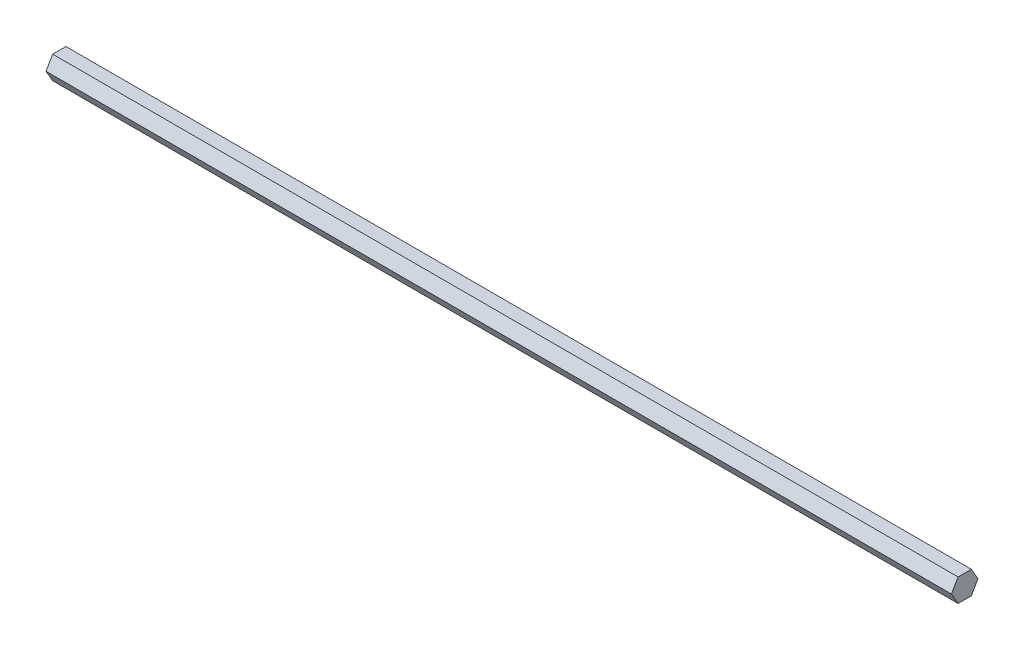
ISO-10303-21;
HEADER;
FILE_DESCRIPTION(('STEP AP214'),'2;1');
FILE_NAME('part.step','',(''),(''),'','','');
FILE_SCHEMA(('AUTOMOTIVE_DESIGN { 1 0 10303 214 1 1 1 1 }'));
ENDSEC;
DATA;
#1=APPLICATION_CONTEXT('core data for automotive mechanical design processes');
#2=APPLICATION_PROTOCOL_DEFINITION('international standard','automotive_design',2000,#1);
#3=PRODUCT_CONTEXT('',#1,'mechanical');
#4=PRODUCT('Part','Part','',(#3));
#5=PRODUCT_RELATED_PRODUCT_CATEGORY('part','',(#4));
#6=PRODUCT_DEFINITION_FORMATION('','',#4);
#7=PRODUCT_DEFINITION_CONTEXT('part definition',#1,'design');
#8=PRODUCT_DEFINITION('design','',#6,#7);
#9=PRODUCT_DEFINITION_SHAPE('','',#8);
#10=(LENGTH_UNIT() NAMED_UNIT(*) SI_UNIT(.MILLI.,.METRE.));
#11=(NAMED_UNIT(*) PLANE_ANGLE_UNIT() SI_UNIT($,.RADIAN.));
#12=(NAMED_UNIT(*) SI_UNIT($,.STERADIAN.) SOLID_ANGLE_UNIT());
#13=UNCERTAINTY_MEASURE_WITH_UNIT(LENGTH_MEASURE(1.E-05),#10,'distance_accuracy_value','');
#14=(GEOMETRIC_REPRESENTATION_CONTEXT(3) GLOBAL_UNCERTAINTY_ASSIGNED_CONTEXT((#13)) GLOBAL_UNIT_ASSIGNED_CONTEXT((#10,
#11,#12)) REPRESENTATION_CONTEXT('',''));
#15=CARTESIAN_POINT('',(0.,0.,0.));
#16=DIRECTION('',(0.,0.,1.));
#17=DIRECTION('',(1.,0.,0.));
#18=AXIS2_PLACEMENT_3D('',#15,#16,#17);
#19=CARTESIAN_POINT('',(500.,-6.34999999999995,-3.66617420935419));
#20=DIRECTION('',(0.,0.499999999999995,0.866025403784442));
#21=DIRECTION('',(0.,-0.866025403784442,0.499999999999995));
#22=AXIS2_PLACEMENT_3D('',#19,#20,#21);
#23=PLANE('',#22);
#24=DIRECTION('',(0.,0.866025403784442,-0.499999999999995));
#25=VECTOR('',#24,1.);
#26=CARTESIAN_POINT('',(0.,-6.34999999999995,-3.66617420935419));
#27=LINE('',#26,#25);
#28=CARTESIAN_POINT('',(0.,-6.34999999999995,-3.66617420935419));
#29=VERTEX_POINT('',#28);
#30=CARTESIAN_POINT('',(0.,0.,-7.33234841870824));
#31=VERTEX_POINT('',#30);
#32=EDGE_CURVE('E128',#29,#31,#27,.T.);
#33=ORIENTED_EDGE('',*,*,#32,.T.);
#34=DIRECTION('',(-1.,0.,0.));
#35=VECTOR('',#34,1.);
#36=CARTESIAN_POINT('',(500.,0.,-7.33234841870824));
#37=LINE('',#36,#35);
#38=CARTESIAN_POINT('',(500.,0.,-7.33234841870824));
#39=VERTEX_POINT('',#38);
#40=EDGE_CURVE('E11',#39,#31,#37,.T.);
#41=ORIENTED_EDGE('',*,*,#40,.F.);
#42=DIRECTION('',(0.,0.866025403784442,-0.499999999999995));
#43=VECTOR('',#42,1.);
#44=CARTESIAN_POINT('',(500.,-6.34999999999995,-3.66617420935419));
#45=LINE('',#44,#43);
#46=CARTESIAN_POINT('',(500.,-6.34999999999995,-3.66617420935419));
#47=VERTEX_POINT('',#46);
#48=EDGE_CURVE('E144',#47,#39,#45,.T.);
#49=ORIENTED_EDGE('',*,*,#48,.F.);
#50=DIRECTION('',(-1.,0.,0.));
#51=VECTOR('',#50,1.);
#52=CARTESIAN_POINT('',(500.,-6.34999999999995,-3.66617420935419));
#53=LINE('',#52,#51);
#54=EDGE_CURVE('E124',#47,#29,#53,.T.);
#55=ORIENTED_EDGE('',*,*,#54,.T.);
#56=EDGE_LOOP('',(#33,#41,#49,#55));
#57=FACE_BOUND('',#56,.T.);
#58=ADVANCED_FACE('F39',(#57),#23,.F.);
#59=CARTESIAN_POINT('',(500.,0.,-7.33234841870824));
#60=DIRECTION('',(0.,-0.500000000000001,0.866025403784438));
#61=DIRECTION('',(0.,-0.866025403784438,-0.500000000000001));
#62=AXIS2_PLACEMENT_3D('',#59,#60,#61);
#63=PLANE('',#62);
#64=DIRECTION('',(0.,0.866025403784438,0.500000000000001));
#65=VECTOR('',#64,1.);
#66=CARTESIAN_POINT('',(0.,0.,-7.33234841870824));
#67=LINE('',#66,#65);
#68=CARTESIAN_POINT('',(0.,6.35,-3.6661742093541));
#69=VERTEX_POINT('',#68);
#70=EDGE_CURVE('E132',#31,#69,#67,.T.);
#71=ORIENTED_EDGE('',*,*,#70,.T.);
#72=DIRECTION('',(-1.,0.,0.));
#73=VECTOR('',#72,1.);
#74=CARTESIAN_POINT('',(500.,6.35,-3.6661742093541));
#75=LINE('',#74,#73);
#76=CARTESIAN_POINT('',(500.,6.35,-3.6661742093541));
#77=VERTEX_POINT('',#76);
#78=EDGE_CURVE('E48',#77,#69,#75,.T.);
#79=ORIENTED_EDGE('',*,*,#78,.F.);
#80=DIRECTION('',(0.,0.866025403784438,0.500000000000001));
#81=VECTOR('',#80,1.);
#82=CARTESIAN_POINT('',(500.,0.,-7.33234841870824));
#83=LINE('',#82,#81);
#84=EDGE_CURVE('E93',#39,#77,#83,.T.);
#85=ORIENTED_EDGE('',*,*,#84,.F.);
#86=ORIENTED_EDGE('',*,*,#40,.T.);
#87=EDGE_LOOP('',(#71,#79,#85,#86));
#88=FACE_BOUND('',#87,.T.);
#89=ADVANCED_FACE('F172',(#88),#63,.F.);
#90=CARTESIAN_POINT('',(500.,6.35,-3.6661742093541));
#91=DIRECTION('',(0.,-1.,0.));
#92=DIRECTION('',(0.,0.,-1.));
#93=AXIS2_PLACEMENT_3D('',#90,#91,#92);
#94=PLANE('',#93);
#95=DIRECTION('',(0.,0.,1.));
#96=VECTOR('',#95,1.);
#97=CARTESIAN_POINT('',(0.,6.35,-3.6661742093541));
#98=LINE('',#97,#96);
#99=CARTESIAN_POINT('',(0.,6.34999999999997,3.66617420935415));
#100=VERTEX_POINT('',#99);
#101=EDGE_CURVE('E135',#69,#100,#98,.T.);
#102=ORIENTED_EDGE('',*,*,#101,.T.);
#103=DIRECTION('',(-1.,0.,0.));
#104=VECTOR('',#103,1.);
#105=CARTESIAN_POINT('',(500.,6.34999999999997,3.66617420935415));
#106=LINE('',#105,#104);
#107=CARTESIAN_POINT('',(500.,6.34999999999997,3.66617420935415));
#108=VERTEX_POINT('',#107);
#109=EDGE_CURVE('E117',#108,#100,#106,.T.);
#110=ORIENTED_EDGE('',*,*,#109,.F.);
#111=DIRECTION('',(0.,0.,1.));
#112=VECTOR('',#111,1.);
#113=CARTESIAN_POINT('',(500.,6.35,-3.6661742093541));
#114=LINE('',#113,#112);
#115=EDGE_CURVE('E106',#77,#108,#114,.T.);
#116=ORIENTED_EDGE('',*,*,#115,.F.);
#117=ORIENTED_EDGE('',*,*,#78,.T.);
#118=EDGE_LOOP('',(#102,#110,#116,#117));
#119=FACE_BOUND('',#118,.T.);
#120=ADVANCED_FACE('F154',(#119),#94,.F.);
#121=CARTESIAN_POINT('',(500.,6.34999999999997,3.66617420935415));
#122=DIRECTION('',(0.,-0.499999999999995,-0.866025403784442));
#123=DIRECTION('',(0.,0.866025403784442,-0.499999999999995));
#124=AXIS2_PLACEMENT_3D('',#121,#122,#123);
#125=PLANE('',#124);
#126=DIRECTION('',(0.,-0.866025403784442,0.499999999999995));
#127=VECTOR('',#126,1.);
#128=CARTESIAN_POINT('',(0.,6.34999999999997,3.66617420935415));
#129=LINE('',#128,#127);
#130=CARTESIAN_POINT('',(0.,0.,7.33234841870824));
#131=VERTEX_POINT('',#130);
#132=EDGE_CURVE('E115',#100,#131,#129,.T.);
#133=ORIENTED_EDGE('',*,*,#132,.T.);
#134=DIRECTION('',(-1.,0.,0.));
#135=VECTOR('',#134,1.);
#136=CARTESIAN_POINT('',(500.,0.,7.33234841870824));
#137=LINE('',#136,#135);
#138=CARTESIAN_POINT('',(500.,0.,7.33234841870824));
#139=VERTEX_POINT('',#138);
#140=EDGE_CURVE('E112',#139,#131,#137,.T.);
#141=ORIENTED_EDGE('',*,*,#140,.F.);
#142=DIRECTION('',(0.,-0.866025403784442,0.499999999999995));
#143=VECTOR('',#142,1.);
#144=CARTESIAN_POINT('',(500.,6.34999999999997,3.66617420935415));
#145=LINE('',#144,#143);
#146=EDGE_CURVE('E100',#108,#139,#145,.T.);
#147=ORIENTED_EDGE('',*,*,#146,.F.);
#148=ORIENTED_EDGE('',*,*,#109,.T.);
#149=EDGE_LOOP('',(#133,#141,#147,#148));
#150=FACE_BOUND('',#149,.T.);
#151=ADVANCED_FACE('F113',(#150),#125,.F.);
#152=CARTESIAN_POINT('',(500.,0.,7.33234841870824));
#153=DIRECTION('',(0.,0.500000000000007,-0.866025403784435));
#154=DIRECTION('',(0.,0.866025403784435,0.500000000000007));
#155=AXIS2_PLACEMENT_3D('',#152,#153,#154);
#156=PLANE('',#155);
#157=DIRECTION('',(0.,-0.866025403784435,-0.500000000000007));
#158=VECTOR('',#157,1.);
#159=CARTESIAN_POINT('',(0.,0.,7.33234841870824));
#160=LINE('',#159,#158);
#161=CARTESIAN_POINT('',(0.,-6.35000000000002,3.66617420935406));
#162=VERTEX_POINT('',#161);
#163=EDGE_CURVE('E79',#131,#162,#160,.T.);
#164=ORIENTED_EDGE('',*,*,#163,.T.);
#165=DIRECTION('',(-1.,0.,0.));
#166=VECTOR('',#165,1.);
#167=CARTESIAN_POINT('',(500.,-6.35000000000002,3.66617420935406));
#168=LINE('',#167,#166);
#169=CARTESIAN_POINT('',(500.,-6.35000000000002,3.66617420935406));
#170=VERTEX_POINT('',#169);
#171=EDGE_CURVE('E118',#170,#162,#168,.T.);
#172=ORIENTED_EDGE('',*,*,#171,.F.);
#173=DIRECTION('',(0.,-0.866025403784435,-0.500000000000007));
#174=VECTOR('',#173,1.);
#175=CARTESIAN_POINT('',(500.,0.,7.33234841870824));
#176=LINE('',#175,#174);
#177=EDGE_CURVE('E104',#139,#170,#176,.T.);
#178=ORIENTED_EDGE('',*,*,#177,.F.);
#179=ORIENTED_EDGE('',*,*,#140,.T.);
#180=EDGE_LOOP('',(#164,#172,#178,#179));
#181=FACE_BOUND('',#180,.T.);
#182=ADVANCED_FACE('F120',(#181),#156,.F.);
#183=CARTESIAN_POINT('',(500.,-6.35000000000002,3.66617420935406));
#184=DIRECTION('',(0.,1.,0.));
#185=DIRECTION('',(0.,0.,1.));
#186=AXIS2_PLACEMENT_3D('',#183,#184,#185);
#187=PLANE('',#186);
#188=DIRECTION('',(0.,0.,-1.));
#189=VECTOR('',#188,1.);
#190=CARTESIAN_POINT('',(0.,-6.35000000000002,3.66617420935406));
#191=LINE('',#190,#189);
#192=EDGE_CURVE('E85',#162,#29,#191,.T.);
#193=ORIENTED_EDGE('',*,*,#192,.T.);
#194=ORIENTED_EDGE('',*,*,#54,.F.);
#195=DIRECTION('',(0.,0.,-1.));
#196=VECTOR('',#195,1.);
#197=CARTESIAN_POINT('',(500.,-6.35000000000002,3.66617420935406));
#198=LINE('',#197,#196);
#199=EDGE_CURVE('E56',#170,#47,#198,.T.);
#200=ORIENTED_EDGE('',*,*,#199,.F.);
#201=ORIENTED_EDGE('',*,*,#171,.T.);
#202=EDGE_LOOP('',(#193,#194,#200,#201));
#203=FACE_BOUND('',#202,.T.);
#204=ADVANCED_FACE('F161',(#203),#187,.F.);
#205=CARTESIAN_POINT('',(500.,0.,0.));
#206=DIRECTION('',(1.,0.,0.));
#207=DIRECTION('',(0.,0.,-1.));
#208=AXIS2_PLACEMENT_3D('',#205,#206,#207);
#209=PLANE('',#208);
#210=ORIENTED_EDGE('',*,*,#48,.T.);
#211=ORIENTED_EDGE('',*,*,#84,.T.);
#212=ORIENTED_EDGE('',*,*,#115,.T.);
#213=ORIENTED_EDGE('',*,*,#146,.T.);
#214=ORIENTED_EDGE('',*,*,#177,.T.);
#215=ORIENTED_EDGE('',*,*,#199,.T.);
#216=EDGE_LOOP('',(#210,#211,#212,#213,#214,#215));
#217=FACE_BOUND('',#216,.T.);
#218=ADVANCED_FACE('F102',(#217),#209,.T.);
#219=CARTESIAN_POINT('',(0.,0.,0.));
#220=DIRECTION('',(1.,0.,0.));
#221=DIRECTION('',(0.,0.,-1.));
#222=AXIS2_PLACEMENT_3D('',#219,#220,#221);
#223=PLANE('',#222);
#224=ORIENTED_EDGE('',*,*,#32,.F.);
#225=ORIENTED_EDGE('',*,*,#192,.F.);
#226=ORIENTED_EDGE('',*,*,#163,.F.);
#227=ORIENTED_EDGE('',*,*,#132,.F.);
#228=ORIENTED_EDGE('',*,*,#101,.F.);
#229=ORIENTED_EDGE('',*,*,#70,.F.);
#230=EDGE_LOOP('',(#224,#225,#226,#227,#228,#229));
#231=FACE_BOUND('',#230,.T.);
#232=ADVANCED_FACE('F157',(#231),#223,.F.);
#233=CLOSED_SHELL('',(#58,#89,#120,#151,#182,#204,#218,#232));
#234=MANIFOLD_SOLID_BREP('B2',#233);
#235=ADVANCED_BREP_SHAPE_REPRESENTATION('',(#18,#234),#14);
#236=SHAPE_DEFINITION_REPRESENTATION(#9,#235);
ENDSEC;
END-ISO-10303-21;
